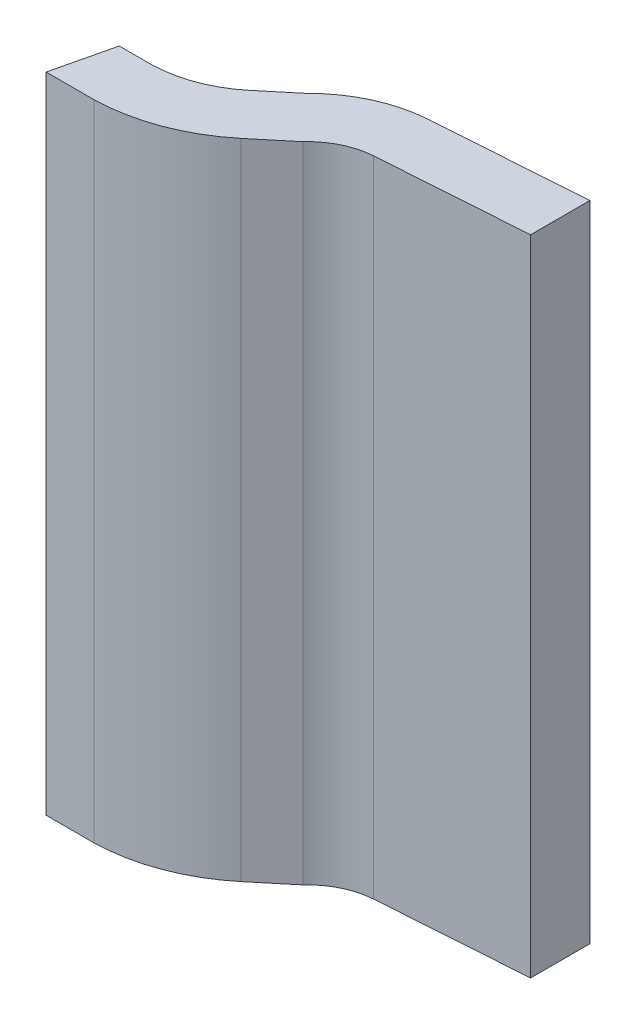
ISO-10303-21;
HEADER;
FILE_DESCRIPTION(('STEP AP214'),'2;1');
FILE_NAME('part.step','',(''),(''),'','','');
FILE_SCHEMA(('AUTOMOTIVE_DESIGN { 1 0 10303 214 1 1 1 1 }'));
ENDSEC;
DATA;
#1=APPLICATION_CONTEXT('core data for automotive mechanical design processes');
#2=APPLICATION_PROTOCOL_DEFINITION('international standard','automotive_design',2000,#1);
#3=PRODUCT_CONTEXT('',#1,'mechanical');
#4=PRODUCT('Part','Part','',(#3));
#5=PRODUCT_RELATED_PRODUCT_CATEGORY('part','',(#4));
#6=PRODUCT_DEFINITION_FORMATION('','',#4);
#7=PRODUCT_DEFINITION_CONTEXT('part definition',#1,'design');
#8=PRODUCT_DEFINITION('design','',#6,#7);
#9=PRODUCT_DEFINITION_SHAPE('','',#8);
#10=(LENGTH_UNIT() NAMED_UNIT(*) SI_UNIT(.MILLI.,.METRE.));
#11=(NAMED_UNIT(*) PLANE_ANGLE_UNIT() SI_UNIT($,.RADIAN.));
#12=(NAMED_UNIT(*) SI_UNIT($,.STERADIAN.) SOLID_ANGLE_UNIT());
#13=UNCERTAINTY_MEASURE_WITH_UNIT(LENGTH_MEASURE(1.E-05),#10,'distance_accuracy_value','');
#14=(GEOMETRIC_REPRESENTATION_CONTEXT(3) GLOBAL_UNCERTAINTY_ASSIGNED_CONTEXT((#13)) GLOBAL_UNIT_ASSIGNED_CONTEXT((#10,
#11,#12)) REPRESENTATION_CONTEXT('',''));
#15=CARTESIAN_POINT('',(0.,0.,0.));
#16=DIRECTION('',(0.,0.,1.));
#17=DIRECTION('',(1.,0.,0.));
#18=AXIS2_PLACEMENT_3D('',#15,#16,#17);
#19=CARTESIAN_POINT('',(26.0963062601032,22.0228286934158,0.7207261850795));
#20=DIRECTION('',(-4.371140912996E-08,0.,1.));
#21=DIRECTION('',(-1.19248806385E-08,1.,0.));
#22=AXIS2_PLACEMENT_3D('',#19,#20,#21);
#23=PLANE('',#22);
#24=CARTESIAN_POINT('',(26.4007352466629,23.5428286970461,0.720507293605183));
#25=DIRECTION('',(1.19248806279121E-08,-1.,0.));
#26=VECTOR('',#25,1.);
#27=LINE('',#24,#26);
#28=CARTESIAN_POINT('',(26.4007352466581,23.542828697046,0.72050729360535));
#29=VERTEX_POINT('',#28);
#30=CARTESIAN_POINT('',(26.4007352829097,20.502828697046,0.720507293605351));
#31=VERTEX_POINT('',#30);
#32=EDGE_CURVE('E28',#29,#31,#27,.T.);
#33=ORIENTED_EDGE('',*,*,#32,.F.);
#34=DIRECTION('',(-1.,-1.19248805772697E-08,-4.371140912996E-08));
#35=VECTOR('',#34,1.);
#36=CARTESIAN_POINT('',(26.0963062419773,23.5428286934158,0.720726185079499));
#37=LINE('',#36,#35);
#38=CARTESIAN_POINT('',(26.1751642617627,23.5428286943561,0.720507283745329));
#39=VERTEX_POINT('',#38);
#40=EDGE_CURVE('E137',#29,#39,#37,.T.);
#41=ORIENTED_EDGE('',*,*,#40,.T.);
#42=DIRECTION('',(-1.1924864526821E-08,1.,0.));
#43=VECTOR('',#42,1.);
#44=CARTESIAN_POINT('',(26.1751124340094,22.0228286943555,0.720726188524229));
#45=LINE('',#44,#43);
#46=CARTESIAN_POINT('',(26.1751642980142,20.5028286943562,0.720507283745326));
#47=VERTEX_POINT('',#46);
#48=EDGE_CURVE('E11',#47,#39,#45,.T.);
#49=ORIENTED_EDGE('',*,*,#48,.F.);
#50=DIRECTION('',(1.,1.19248805772697E-08,4.371140912996E-08));
#51=VECTOR('',#50,1.);
#52=CARTESIAN_POINT('',(26.096306278229,20.5028286934158,0.7207261850795));
#53=LINE('',#52,#51);
#54=EDGE_CURVE('E121',#47,#31,#53,.T.);
#55=ORIENTED_EDGE('',*,*,#54,.T.);
#56=EDGE_LOOP('',(#33,#41,#49,#55));
#57=FACE_BOUND('',#56,.T.);
#58=ADVANCED_FACE('F16',(#57),#23,.T.);
#59=CARTESIAN_POINT('',(26.3061678961427,22.0228286959183,0.167381011814847));
#60=DIRECTION('',(-0.973080277416046,-1.16038505481664E-08,-0.230466426413724));
#61=DIRECTION('',(0.230466426413724,2.7482846261653E-09,-0.973080277416046));
#62=AXIS2_PLACEMENT_3D('',#59,#60,#61);
#63=PLANE('',#62);
#64=DIRECTION('',(-1.1924864526821E-08,1.,0.));
#65=VECTOR('',#64,1.);
#66=CARTESIAN_POINT('',(26.2412700258147,22.0228286951445,0.44139418868007));
#67=LINE('',#66,#65);
#68=CARTESIAN_POINT('',(26.2412700439405,20.5028286951445,0.44139418868007));
#69=VERTEX_POINT('',#68);
#70=CARTESIAN_POINT('',(26.241270007689,23.5428286951445,0.441394188680069));
#71=VERTEX_POINT('',#70);
#72=EDGE_CURVE('E94',#69,#71,#67,.T.);
#73=ORIENTED_EDGE('',*,*,#72,.F.);
#74=DIRECTION('',(-0.230466426413724,-2.7482846261653E-09,0.973080277416046));
#75=VECTOR('',#74,1.);
#76=CARTESIAN_POINT('',(26.3061679142685,20.5028286959183,0.167381011814847));
#77=LINE('',#76,#75);
#78=EDGE_CURVE('E98',#69,#47,#77,.T.);
#79=ORIENTED_EDGE('',*,*,#78,.T.);
#80=ORIENTED_EDGE('',*,*,#48,.T.);
#81=DIRECTION('',(0.230466426413724,2.7482846261653E-09,-0.973080277416046));
#82=VECTOR('',#81,1.);
#83=CARTESIAN_POINT('',(26.3061678780168,23.5428286959183,0.167381011814847));
#84=LINE('',#83,#82);
#85=EDGE_CURVE('E101',#39,#71,#84,.T.);
#86=ORIENTED_EDGE('',*,*,#85,.T.);
#87=EDGE_LOOP('',(#73,#79,#80,#86));
#88=FACE_BOUND('',#87,.T.);
#89=ADVANCED_FACE('F96',(#88),#63,.T.);
#90=CARTESIAN_POINT('',(26.3817566157798,22.0228286968197,-0.102093660788064));
#91=DIRECTION('',(1.19248805772697E-08,-1.,0.));
#92=DIRECTION('',(-4.371140912996E-08,0.,1.));
#93=AXIS2_PLACEMENT_3D('',#90,#91,#92);
#94=CYLINDRICAL_SURFACE('',#93,0.822819858345);
#95=DIRECTION('',(1.19248807527414E-08,-1.,0.));
#96=VECTOR('',#95,1.);
#97=CARTESIAN_POINT('',(26.9069920178912,22.0228287030831,0.531278498101716));
#98=LINE('',#97,#96);
#99=CARTESIAN_POINT('',(26.9069919997654,23.5428287030831,0.531278498101716));
#100=VERTEX_POINT('',#99);
#101=CARTESIAN_POINT('',(26.9069920360171,20.5028287030831,0.531278498101716));
#102=VERTEX_POINT('',#101);
#103=EDGE_CURVE('E106',#100,#102,#98,.T.);
#104=ORIENTED_EDGE('',*,*,#103,.F.);
#105=CARTESIAN_POINT('',(26.381756597654,23.5428286968198,-0.102093660788064));
#106=DIRECTION('',(1.19248805772697E-08,-1.,0.));
#107=DIRECTION('',(-4.371140912996E-08,0.,1.));
#108=AXIS2_PLACEMENT_3D('',#105,#106,#107);
#109=CIRCLE('',#108,0.822819858345);
#110=EDGE_CURVE('E195',#100,#29,#109,.T.);
#111=ORIENTED_EDGE('',*,*,#110,.T.);
#112=ORIENTED_EDGE('',*,*,#32,.T.);
#113=CARTESIAN_POINT('',(26.3817566339056,20.5028286968197,-0.102093660788064));
#114=DIRECTION('',(-1.19248805772697E-08,1.,0.));
#115=DIRECTION('',(-4.371140912996E-08,0.,1.));
#116=AXIS2_PLACEMENT_3D('',#113,#114,#115);
#117=CIRCLE('',#116,0.822819858345);
#118=EDGE_CURVE('E126',#31,#102,#117,.T.);
#119=ORIENTED_EDGE('',*,*,#118,.T.);
#120=EDGE_LOOP('',(#104,#111,#112,#119));
#121=FACE_BOUND('',#120,.T.);
#122=ADVANCED_FACE('F173',(#121),#94,.T.);
#123=CARTESIAN_POINT('',(26.1156218500662,22.0228286936461,0.441394183187811));
#124=DIRECTION('',(4.371140912996E-08,0.,-1.));
#125=DIRECTION('',(1.19248806385E-08,-1.,0.));
#126=AXIS2_PLACEMENT_3D('',#123,#124,#125);
#127=PLANE('',#126);
#128=CARTESIAN_POINT('',(26.3972145124934,23.5428286970041,0.441394195496623));
#129=DIRECTION('',(1.19248806279121E-08,-1.,0.));
#130=VECTOR('',#129,1.);
#131=LINE('',#128,#130);
#132=CARTESIAN_POINT('',(26.3972145124997,23.5428286970041,0.441174322865624));
#133=VERTEX_POINT('',#132);
#134=CARTESIAN_POINT('',(26.3972145487513,20.502828697004,0.441174322865624));
#135=VERTEX_POINT('',#134);
#136=EDGE_CURVE('E110',#133,#135,#131,.T.);
#137=ORIENTED_EDGE('',*,*,#136,.T.);
#138=DIRECTION('',(-1.,-1.19248805772697E-08,-4.371140912996E-08));
#139=VECTOR('',#138,1.);
#140=CARTESIAN_POINT('',(26.115621868192,20.5028286936461,0.441394183187811));
#141=LINE('',#140,#139);
#142=EDGE_CURVE('E109',#135,#69,#141,.T.);
#143=ORIENTED_EDGE('',*,*,#142,.T.);
#144=ORIENTED_EDGE('',*,*,#72,.T.);
#145=DIRECTION('',(1.,1.19248805772697E-08,4.371140912996E-08));
#146=VECTOR('',#145,1.);
#147=CARTESIAN_POINT('',(26.1156218319403,23.5428286936461,0.44139418318781));
#148=LINE('',#147,#146);
#149=EDGE_CURVE('E138',#71,#133,#148,.T.);
#150=ORIENTED_EDGE('',*,*,#149,.T.);
#151=EDGE_LOOP('',(#137,#143,#144,#150));
#152=FACE_BOUND('',#151,.T.);
#153=ADVANCED_FACE('F18',(#152),#127,.T.);
#154=CARTESIAN_POINT('',(26.9069920178912,22.0228287030831,0.531278498101716));
#155=DIRECTION('',(0.638335835947795,7.6120788299222E-09,0.769757988295562));
#156=DIRECTION('',(-0.769757988295562,-9.17927213095645E-09,0.638335835947795));
#157=AXIS2_PLACEMENT_3D('',#154,#155,#156);
#158=PLANE('',#157);
#159=ORIENTED_EDGE('',*,*,#103,.T.);
#160=DIRECTION('',(0.769757988295562,9.17927213095645E-09,-0.638335835947795));
#161=VECTOR('',#160,1.);
#162=CARTESIAN_POINT('',(26.9069920360171,20.5028287030831,0.531278498101716));
#163=LINE('',#162,#161);
#164=CARTESIAN_POINT('',(27.0666300846576,20.5028287049868,0.39889573783472));
#165=VERTEX_POINT('',#164);
#166=EDGE_CURVE('E519',#102,#165,#163,.T.);
#167=ORIENTED_EDGE('',*,*,#166,.T.);
#168=DIRECTION('',(-1.19248805772697E-08,1.,0.));
#169=VECTOR('',#168,1.);
#170=CARTESIAN_POINT('',(27.0666300665319,22.0228287049868,0.39889573783472));
#171=LINE('',#170,#169);
#172=CARTESIAN_POINT('',(27.0666300484061,23.5428287049867,0.39889573783472));
#173=VERTEX_POINT('',#172);
#174=EDGE_CURVE('E41',#165,#173,#171,.T.);
#175=ORIENTED_EDGE('',*,*,#174,.T.);
#176=DIRECTION('',(-0.769757988295562,-9.17927213095645E-09,0.638335835947795));
#177=VECTOR('',#176,1.);
#178=CARTESIAN_POINT('',(26.9069919997654,23.5428287030831,0.531278498101716));
#179=LINE('',#178,#177);
#180=EDGE_CURVE('E200',#173,#100,#179,.T.);
#181=ORIENTED_EDGE('',*,*,#180,.T.);
#182=EDGE_LOOP('',(#159,#167,#175,#181));
#183=FACE_BOUND('',#182,.T.);
#184=ADVANCED_FACE('F168',(#183),#158,.T.);
#185=CARTESIAN_POINT('',(26.3817566157798,22.0228286968197,-0.102093660788064));
#186=DIRECTION('',(1.19248805772697E-08,-1.,0.));
#187=DIRECTION('',(-4.371140912996E-08,0.,1.));
#188=AXIS2_PLACEMENT_3D('',#185,#186,#187);
#189=CYLINDRICAL_SURFACE('',#188,0.543487855609);
#190=CARTESIAN_POINT('',(26.381756597654,23.5428286968198,-0.102093660788064));
#191=DIRECTION('',(1.19248805772697E-08,-1.,0.));
#192=DIRECTION('',(-4.371140912996E-08,0.,1.));
#193=AXIS2_PLACEMENT_3D('',#190,#191,#192);
#194=CIRCLE('',#193,0.543487855609);
#195=CARTESIAN_POINT('',(26.7286843722922,23.5428287009568,0.316260457609638));
#196=VERTEX_POINT('',#195);
#197=EDGE_CURVE('E214',#196,#133,#194,.T.);
#198=ORIENTED_EDGE('',*,*,#197,.F.);
#199=DIRECTION('',(-1.19248807527414E-08,1.,0.));
#200=VECTOR('',#199,1.);
#201=CARTESIAN_POINT('',(26.7286843904179,22.0228287009568,0.316260457609638));
#202=LINE('',#201,#200);
#203=CARTESIAN_POINT('',(26.7286844085437,20.5028287009568,0.316260457609638));
#204=VERTEX_POINT('',#203);
#205=EDGE_CURVE('E483',#204,#196,#202,.T.);
#206=ORIENTED_EDGE('',*,*,#205,.F.);
#207=CARTESIAN_POINT('',(26.3817566339056,20.5028286968197,-0.102093660788064));
#208=DIRECTION('',(-1.19248805772697E-08,1.,0.));
#209=DIRECTION('',(-4.371140912996E-08,0.,1.));
#210=AXIS2_PLACEMENT_3D('',#207,#208,#209);
#211=CIRCLE('',#210,0.543487855609);
#212=EDGE_CURVE('E116',#135,#204,#211,.T.);
#213=ORIENTED_EDGE('',*,*,#212,.F.);
#214=ORIENTED_EDGE('',*,*,#136,.F.);
#215=EDGE_LOOP('',(#198,#206,#213,#214));
#216=FACE_BOUND('',#215,.T.);
#217=ADVANCED_FACE('F157',(#216),#189,.F.);
#218=CARTESIAN_POINT('',(27.3142709423559,22.0228287079399,0.623571166960452));
#219=DIRECTION('',(-1.19248805772697E-08,1.,0.));
#220=DIRECTION('',(4.371140912996E-08,0.,-1.));
#221=AXIS2_PLACEMENT_3D('',#218,#219,#220);
#222=CYLINDRICAL_SURFACE('',#221,0.334372624226);
#223=CARTESIAN_POINT('',(27.3142709604818,20.5028287079398,0.623571166960452));
#224=DIRECTION('',(-1.19248805772697E-08,1.,0.));
#225=DIRECTION('',(4.371140912996E-08,0.,-1.));
#226=AXIS2_PLACEMENT_3D('',#223,#224,#225);
#227=CIRCLE('',#226,0.334372624226);
#228=CARTESIAN_POINT('',(27.2912045449858,20.5028287076648,0.289995100211186));
#229=VERTEX_POINT('',#228);
#230=EDGE_CURVE('E515',#229,#165,#227,.T.);
#231=ORIENTED_EDGE('',*,*,#230,.F.);
#232=DIRECTION('',(1.19248806577035E-08,-1.,0.));
#233=VECTOR('',#232,1.);
#234=CARTESIAN_POINT('',(27.29120452686,22.0228287076648,0.289995100211186));
#235=LINE('',#234,#233);
#236=CARTESIAN_POINT('',(27.2912045087342,23.5428287076648,0.289995100211186));
#237=VERTEX_POINT('',#236);
#238=EDGE_CURVE('E489',#237,#229,#235,.T.);
#239=ORIENTED_EDGE('',*,*,#238,.F.);
#240=CARTESIAN_POINT('',(27.3142709242301,23.5428287079399,0.623571166960452));
#241=DIRECTION('',(1.19248805772697E-08,-1.,0.));
#242=DIRECTION('',(4.37114208029485E-08,0.,-1.));
#243=AXIS2_PLACEMENT_3D('',#240,#241,#242);
#244=CIRCLE('',#243,0.334372624226);
#245=EDGE_CURVE('E528',#173,#237,#244,.T.);
#246=ORIENTED_EDGE('',*,*,#245,.F.);
#247=ORIENTED_EDGE('',*,*,#174,.F.);
#248=EDGE_LOOP('',(#231,#239,#246,#247));
#249=FACE_BOUND('',#248,.T.);
#250=ADVANCED_FACE('F167',(#249),#222,.F.);
#251=CARTESIAN_POINT('',(26.7286843904179,22.0228287009568,0.316260457609638));
#252=DIRECTION('',(-0.638335835947795,-7.6120788299222E-09,-0.769757988295562));
#253=DIRECTION('',(0.769757988295562,9.17927213095645E-09,-0.638335835947795));
#254=AXIS2_PLACEMENT_3D('',#251,#252,#253);
#255=PLANE('',#254);
#256=ORIENTED_EDGE('',*,*,#205,.T.);
#257=DIRECTION('',(0.769757988295562,9.17927213095645E-09,-0.638335835947795));
#258=VECTOR('',#257,1.);
#259=CARTESIAN_POINT('',(26.7286843722922,23.5428287009568,0.316260457609638));
#260=LINE('',#259,#258);
#261=CARTESIAN_POINT('',(26.8757132151317,23.5428287027101,0.194334110978476));
#262=VERTEX_POINT('',#261);
#263=EDGE_CURVE('E486',#196,#262,#260,.T.);
#264=ORIENTED_EDGE('',*,*,#263,.T.);
#265=DIRECTION('',(-1.19248805772697E-08,1.,0.));
#266=VECTOR('',#265,1.);
#267=CARTESIAN_POINT('',(26.8757132332575,22.0228287027101,0.194334110978476));
#268=LINE('',#267,#266);
#269=CARTESIAN_POINT('',(26.8757132513833,20.5028287027101,0.194334110978476));
#270=VERTEX_POINT('',#269);
#271=EDGE_CURVE('E496',#270,#262,#268,.T.);
#272=ORIENTED_EDGE('',*,*,#271,.F.);
#273=DIRECTION('',(-0.769757988295562,-9.17927213095645E-09,0.638335835947795));
#274=VECTOR('',#273,1.);
#275=CARTESIAN_POINT('',(26.7286844085437,20.5028287009568,0.316260457609638));
#276=LINE('',#275,#274);
#277=EDGE_CURVE('E487',#270,#204,#276,.T.);
#278=ORIENTED_EDGE('',*,*,#277,.T.);
#279=EDGE_LOOP('',(#256,#264,#272,#278));
#280=FACE_BOUND('',#279,.T.);
#281=ADVANCED_FACE('F282',(#280),#255,.T.);
#282=CARTESIAN_POINT('',(27.29120452686,22.0228287076648,0.289995100211186));
#283=DIRECTION('',(0.0689841626542901,8.22628183975446E-10,0.997617755106076));
#284=DIRECTION('',(-0.997617755106076,-1.18964726524883E-08,0.0689841626542901));
#285=AXIS2_PLACEMENT_3D('',#282,#283,#284);
#286=PLANE('',#285);
#287=ORIENTED_EDGE('',*,*,#238,.T.);
#288=DIRECTION('',(0.997617755106076,1.18964726524883E-08,-0.0689841626542901));
#289=VECTOR('',#288,1.);
#290=CARTESIAN_POINT('',(27.2912045449858,20.5028287076648,0.289995100211186));
#291=LINE('',#290,#289);
#292=CARTESIAN_POINT('',(27.9846659875539,20.5028287159342,0.242043009639363));
#293=VERTEX_POINT('',#292);
#294=EDGE_CURVE('E520',#229,#293,#291,.T.);
#295=ORIENTED_EDGE('',*,*,#294,.T.);
#296=DIRECTION('',(-1.19248806385E-08,1.,0.));
#297=VECTOR('',#296,1.);
#298=CARTESIAN_POINT('',(27.9846659694281,22.0228287159342,0.242043009639363));
#299=LINE('',#298,#297);
#300=CARTESIAN_POINT('',(27.9846659513023,23.5428287159343,0.242043009639363));
#301=VERTEX_POINT('',#300);
#302=EDGE_CURVE('E525',#293,#301,#299,.T.);
#303=ORIENTED_EDGE('',*,*,#302,.T.);
#304=DIRECTION('',(-0.997617755106076,-1.18964726524883E-08,0.0689841626542901));
#305=VECTOR('',#304,1.);
#306=CARTESIAN_POINT('',(27.2912045087342,23.5428287076648,0.289995100211186));
#307=LINE('',#306,#305);
#308=EDGE_CURVE('E532',#301,#237,#307,.T.);
#309=ORIENTED_EDGE('',*,*,#308,.T.);
#310=EDGE_LOOP('',(#287,#295,#303,#309));
#311=FACE_BOUND('',#310,.T.);
#312=ADVANCED_FACE('F290',(#311),#286,.T.);
#313=CARTESIAN_POINT('',(27.9846659755434,22.0228287159342,0.102141690556363));
#314=DIRECTION('',(-1.,-1.19248806385E-08,-4.37114090074993E-08));
#315=DIRECTION('',(4.37114090074993E-08,0.,-1.));
#316=AXIS2_PLACEMENT_3D('',#313,#314,#315);
#317=PLANE('',#316);
#318=DIRECTION('',(-4.371140912996E-08,0.,1.));
#319=VECTOR('',#318,1.);
#320=CARTESIAN_POINT('',(27.9846659727446,20.5028287159342,0.580840877548363));
#321=LINE('',#320,#319);
#322=CARTESIAN_POINT('',(27.9846659997911,20.5028287159342,-0.0379102403086369));
#323=VERTEX_POINT('',#322);
#324=EDGE_CURVE('E512',#323,#293,#321,.T.);
#325=ORIENTED_EDGE('',*,*,#324,.F.);
#326=DIRECTION('',(1.19248806577035E-08,-1.,0.));
#327=VECTOR('',#326,1.);
#328=CARTESIAN_POINT('',(27.9846659816653,22.0228287159342,-0.0379102403086369));
#329=LINE('',#328,#327);
#330=CARTESIAN_POINT('',(27.9846659635395,23.5428287159343,-0.0379102403086369));
#331=VERTEX_POINT('',#330);
#332=EDGE_CURVE('E222',#331,#323,#329,.T.);
#333=ORIENTED_EDGE('',*,*,#332,.F.);
#334=DIRECTION('',(4.371140912996E-08,0.,-1.));
#335=VECTOR('',#334,1.);
#336=CARTESIAN_POINT('',(27.984665936493,23.5428287159343,0.580840877548363));
#337=LINE('',#336,#335);
#338=EDGE_CURVE('E498',#301,#331,#337,.T.);
#339=ORIENTED_EDGE('',*,*,#338,.F.);
#340=ORIENTED_EDGE('',*,*,#302,.F.);
#341=EDGE_LOOP('',(#325,#333,#339,#340));
#342=FACE_BOUND('',#341,.T.);
#343=ADVANCED_FACE('F299',(#342),#317,.F.);
#344=CARTESIAN_POINT('',(26.1059640732196,20.5028286935309,0.580840795427655));
#345=DIRECTION('',(1.19248805772697E-08,-1.,0.));
#346=DIRECTION('',(-4.371140912996E-08,0.,1.));
#347=AXIS2_PLACEMENT_3D('',#344,#345,#346);
#348=PLANE('',#347);
#349=ORIENTED_EDGE('',*,*,#118,.F.);
#350=ORIENTED_EDGE('',*,*,#54,.F.);
#351=ORIENTED_EDGE('',*,*,#78,.F.);
#352=ORIENTED_EDGE('',*,*,#142,.F.);
#353=ORIENTED_EDGE('',*,*,#212,.T.);
#354=ORIENTED_EDGE('',*,*,#277,.F.);
#355=CARTESIAN_POINT('',(27.3142709604818,20.5028287079398,0.623571166960452));
#356=DIRECTION('',(-1.19248805772697E-08,1.,0.));
#357=DIRECTION('',(4.371140912996E-08,0.,-1.));
#358=AXIS2_PLACEMENT_3D('',#355,#356,#357);
#359=CIRCLE('',#358,0.613658956129);
#360=CARTESIAN_POINT('',(27.2719382112388,20.5028287074351,0.0113740967460271));
#361=VERTEX_POINT('',#360);
#362=EDGE_CURVE('E450',#361,#270,#359,.T.);
#363=ORIENTED_EDGE('',*,*,#362,.F.);
#364=DIRECTION('',(-0.997617755106076,-1.18964726524883E-08,0.0689841626542901));
#365=VECTOR('',#364,1.);
#366=CARTESIAN_POINT('',(27.2719382112388,20.5028287074351,0.0113740967460271));
#367=LINE('',#366,#365);
#368=EDGE_CURVE('E217',#323,#361,#367,.T.);
#369=ORIENTED_EDGE('',*,*,#368,.F.);
#370=ORIENTED_EDGE('',*,*,#324,.T.);
#371=ORIENTED_EDGE('',*,*,#294,.F.);
#372=ORIENTED_EDGE('',*,*,#230,.T.);
#373=ORIENTED_EDGE('',*,*,#166,.F.);
#374=EDGE_LOOP('',(#349,#350,#351,#352,#353,#354,#363,#369,#370,#371,#372,#373));
#375=FACE_BOUND('',#374,.T.);
#376=ADVANCED_FACE('F119',(#375),#348,.T.);
#377=CARTESIAN_POINT('',(27.3142709423559,22.0228287079399,0.623571166960452));
#378=DIRECTION('',(-1.19248805772697E-08,1.,0.));
#379=DIRECTION('',(4.371140912996E-08,0.,-1.));
#380=AXIS2_PLACEMENT_3D('',#377,#378,#379);
#381=CYLINDRICAL_SURFACE('',#380,0.613658956129);
#382=DIRECTION('',(-1.19248806577035E-08,1.,0.));
#383=VECTOR('',#382,1.);
#384=CARTESIAN_POINT('',(27.271938193113,22.022828707435,0.0113740967460271));
#385=LINE('',#384,#383);
#386=CARTESIAN_POINT('',(27.2719381749871,23.542828707435,0.0113740967460271));
#387=VERTEX_POINT('',#386);
#388=EDGE_CURVE('E232',#361,#387,#385,.T.);
#389=ORIENTED_EDGE('',*,*,#388,.F.);
#390=ORIENTED_EDGE('',*,*,#362,.T.);
#391=ORIENTED_EDGE('',*,*,#271,.T.);
#392=CARTESIAN_POINT('',(27.3142709242301,23.5428287079399,0.623571166960452));
#393=DIRECTION('',(-1.19248805772697E-08,1.,0.));
#394=DIRECTION('',(4.371140912996E-08,0.,-1.));
#395=AXIS2_PLACEMENT_3D('',#392,#393,#394);
#396=CIRCLE('',#395,0.613658956129);
#397=EDGE_CURVE('E452',#387,#262,#396,.T.);
#398=ORIENTED_EDGE('',*,*,#397,.F.);
#399=EDGE_LOOP('',(#389,#390,#391,#398));
#400=FACE_BOUND('',#399,.T.);
#401=ADVANCED_FACE('F318',(#400),#381,.T.);
#402=CARTESIAN_POINT('',(26.1059640369679,23.542828693531,0.580840795427655));
#403=DIRECTION('',(-1.19248805772697E-08,1.,0.));
#404=DIRECTION('',(4.371140912996E-08,0.,-1.));
#405=AXIS2_PLACEMENT_3D('',#402,#403,#404);
#406=PLANE('',#405);
#407=ORIENTED_EDGE('',*,*,#197,.T.);
#408=ORIENTED_EDGE('',*,*,#149,.F.);
#409=ORIENTED_EDGE('',*,*,#85,.F.);
#410=ORIENTED_EDGE('',*,*,#40,.F.);
#411=ORIENTED_EDGE('',*,*,#110,.F.);
#412=ORIENTED_EDGE('',*,*,#180,.F.);
#413=ORIENTED_EDGE('',*,*,#245,.T.);
#414=ORIENTED_EDGE('',*,*,#308,.F.);
#415=ORIENTED_EDGE('',*,*,#338,.T.);
#416=DIRECTION('',(0.997617755106076,1.18964726524883E-08,-0.0689841626542901));
#417=VECTOR('',#416,1.);
#418=CARTESIAN_POINT('',(27.2719381749871,23.542828707435,0.0113740967460271));
#419=LINE('',#418,#417);
#420=EDGE_CURVE('E227',#387,#331,#419,.T.);
#421=ORIENTED_EDGE('',*,*,#420,.F.);
#422=ORIENTED_EDGE('',*,*,#397,.T.);
#423=ORIENTED_EDGE('',*,*,#263,.F.);
#424=EDGE_LOOP('',(#407,#408,#409,#410,#411,#412,#413,#414,#415,#421,#422,#423));
#425=FACE_BOUND('',#424,.T.);
#426=ADVANCED_FACE('F203',(#425),#406,.T.);
#427=CARTESIAN_POINT('',(27.271938193113,22.022828707435,0.0113740967460271));
#428=DIRECTION('',(-0.0689841626542901,-8.22628183975446E-10,-0.997617755106076));
#429=DIRECTION('',(0.997617755106076,1.18964726524883E-08,-0.0689841626542901));
#430=AXIS2_PLACEMENT_3D('',#427,#428,#429);
#431=PLANE('',#430);
#432=ORIENTED_EDGE('',*,*,#388,.T.);
#433=ORIENTED_EDGE('',*,*,#420,.T.);
#434=ORIENTED_EDGE('',*,*,#332,.T.);
#435=ORIENTED_EDGE('',*,*,#368,.T.);
#436=EDGE_LOOP('',(#432,#433,#434,#435));
#437=FACE_BOUND('',#436,.T.);
#438=ADVANCED_FACE('F336',(#437),#431,.T.);
#439=CLOSED_SHELL('',(#58,#89,#122,#153,#184,#217,#250,#281,#312,#343,#376,#401,#426,#438));
#440=MANIFOLD_SOLID_BREP('B1',#439);
#441=ADVANCED_BREP_SHAPE_REPRESENTATION('',(#18,#440),#14);
#442=SHAPE_DEFINITION_REPRESENTATION(#9,#441);
ENDSEC;
END-ISO-10303-21;
